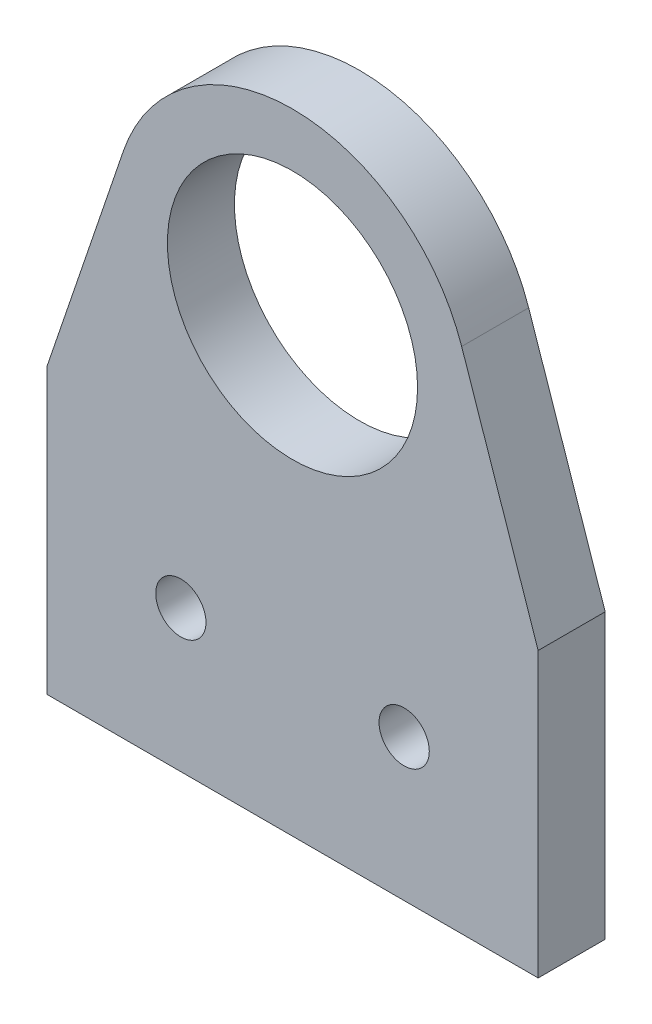
ISO-10303-21;
HEADER;
FILE_DESCRIPTION(('STEP AP214'),'2;1');
FILE_NAME('part.step','',(''),(''),'','','');
FILE_SCHEMA(('AUTOMOTIVE_DESIGN { 1 0 10303 214 1 1 1 1 }'));
ENDSEC;
DATA;
#1=APPLICATION_CONTEXT('core data for automotive mechanical design processes');
#2=APPLICATION_PROTOCOL_DEFINITION('international standard','automotive_design',2000,#1);
#3=PRODUCT_CONTEXT('',#1,'mechanical');
#4=PRODUCT('Part','Part','',(#3));
#5=PRODUCT_RELATED_PRODUCT_CATEGORY('part','',(#4));
#6=PRODUCT_DEFINITION_FORMATION('','',#4);
#7=PRODUCT_DEFINITION_CONTEXT('part definition',#1,'design');
#8=PRODUCT_DEFINITION('design','',#6,#7);
#9=PRODUCT_DEFINITION_SHAPE('','',#8);
#10=(LENGTH_UNIT() NAMED_UNIT(*) SI_UNIT(.MILLI.,.METRE.));
#11=(NAMED_UNIT(*) PLANE_ANGLE_UNIT() SI_UNIT($,.RADIAN.));
#12=(NAMED_UNIT(*) SI_UNIT($,.STERADIAN.) SOLID_ANGLE_UNIT());
#13=UNCERTAINTY_MEASURE_WITH_UNIT(LENGTH_MEASURE(1.E-05),#10,'distance_accuracy_value','');
#14=(GEOMETRIC_REPRESENTATION_CONTEXT(3) GLOBAL_UNCERTAINTY_ASSIGNED_CONTEXT((#13)) GLOBAL_UNIT_ASSIGNED_CONTEXT((#10,
#11,#12)) REPRESENTATION_CONTEXT('',''));
#15=CARTESIAN_POINT('',(0.,0.,0.));
#16=DIRECTION('',(0.,0.,1.));
#17=DIRECTION('',(1.,0.,0.));
#18=AXIS2_PLACEMENT_3D('',#15,#16,#17);
#19=CARTESIAN_POINT('',(0.,0.,6.));
#20=DIRECTION('',(0.,0.,-1.));
#21=DIRECTION('',(-1.,0.,0.));
#22=AXIS2_PLACEMENT_3D('',#19,#20,#21);
#23=CYLINDRICAL_SURFACE('',#22,16.);
#24=CARTESIAN_POINT('',(0.,0.,0.));
#25=DIRECTION('',(0.,0.,1.));
#26=DIRECTION('',(1.,0.,0.));
#27=AXIS2_PLACEMENT_3D('',#24,#25,#26);
#28=CIRCLE('',#27,16.);
#29=CARTESIAN_POINT('',(-15.1482527459947,5.1507706941256,0.));
#30=VERTEX_POINT('',#29);
#31=CARTESIAN_POINT('',(15.1482527459947,5.1507706941256,0.));
#32=VERTEX_POINT('',#31);
#33=EDGE_CURVE('E121',#30,#32,#28,.F.);
#34=ORIENTED_EDGE('',*,*,#33,.F.);
#35=DIRECTION('',(0.,0.,-1.));
#36=VECTOR('',#35,1.);
#37=CARTESIAN_POINT('',(-15.1482527459947,5.1507706941256,6.));
#38=LINE('',#37,#36);
#39=CARTESIAN_POINT('',(-15.1482527459947,5.1507706941256,6.));
#40=VERTEX_POINT('',#39);
#41=EDGE_CURVE('E11',#40,#30,#38,.T.);
#42=ORIENTED_EDGE('',*,*,#41,.F.);
#43=CARTESIAN_POINT('',(0.,0.,6.));
#44=DIRECTION('',(0.,0.,1.));
#45=DIRECTION('',(1.,0.,0.));
#46=AXIS2_PLACEMENT_3D('',#43,#44,#45);
#47=CIRCLE('',#46,16.);
#48=CARTESIAN_POINT('',(15.1482527459947,5.1507706941256,6.));
#49=VERTEX_POINT('',#48);
#50=EDGE_CURVE('E139',#40,#49,#47,.F.);
#51=ORIENTED_EDGE('',*,*,#50,.T.);
#52=DIRECTION('',(0.,0.,-1.));
#53=VECTOR('',#52,1.);
#54=CARTESIAN_POINT('',(15.1482527459947,5.1507706941256,6.));
#55=LINE('',#54,#53);
#56=EDGE_CURVE('E52',#49,#32,#55,.T.);
#57=ORIENTED_EDGE('',*,*,#56,.T.);
#58=EDGE_LOOP('',(#34,#42,#51,#57));
#59=FACE_BOUND('',#58,.T.);
#60=ADVANCED_FACE('F36',(#59),#23,.T.);
#61=CARTESIAN_POINT('',(-15.1482527459947,5.15077069412561,6.));
#62=DIRECTION('',(-0.94676579662467,0.321923168382851,0.));
#63=DIRECTION('',(-0.321923168382851,-0.94676579662467,0.));
#64=AXIS2_PLACEMENT_3D('',#61,#62,#63);
#65=PLANE('',#64);
#66=DIRECTION('',(0.321923168382851,0.946765796624671,0.));
#67=VECTOR('',#66,1.);
#68=CARTESIAN_POINT('',(-15.1482527459947,5.15077069412561,0.));
#69=LINE('',#68,#67);
#70=CARTESIAN_POINT('',(-22.,-15.,0.));
#71=VERTEX_POINT('',#70);
#72=EDGE_CURVE('E123',#71,#30,#69,.T.);
#73=ORIENTED_EDGE('',*,*,#72,.F.);
#74=DIRECTION('',(0.,0.,-1.));
#75=VECTOR('',#74,1.);
#76=CARTESIAN_POINT('',(-22.,-15.,6.));
#77=LINE('',#76,#75);
#78=CARTESIAN_POINT('',(-22.,-15.,6.));
#79=VERTEX_POINT('',#78);
#80=EDGE_CURVE('E44',#79,#71,#77,.T.);
#81=ORIENTED_EDGE('',*,*,#80,.F.);
#82=DIRECTION('',(0.321923168382851,0.946765796624671,0.));
#83=VECTOR('',#82,1.);
#84=CARTESIAN_POINT('',(-15.1482527459947,5.15077069412561,6.));
#85=LINE('',#84,#83);
#86=EDGE_CURVE('E251',#79,#40,#85,.T.);
#87=ORIENTED_EDGE('',*,*,#86,.T.);
#88=ORIENTED_EDGE('',*,*,#41,.T.);
#89=EDGE_LOOP('',(#73,#81,#87,#88));
#90=FACE_BOUND('',#89,.T.);
#91=ADVANCED_FACE('F148',(#90),#65,.T.);
#92=CARTESIAN_POINT('',(-22.,0.,6.));
#93=DIRECTION('',(-1.,0.,0.));
#94=DIRECTION('',(0.,0.,1.));
#95=AXIS2_PLACEMENT_3D('',#92,#93,#94);
#96=PLANE('',#95);
#97=DIRECTION('',(0.,1.,0.));
#98=VECTOR('',#97,1.);
#99=CARTESIAN_POINT('',(-22.,0.,0.));
#100=LINE('',#99,#98);
#101=CARTESIAN_POINT('',(-22.,-40.4,0.));
#102=VERTEX_POINT('',#101);
#103=EDGE_CURVE('E127',#102,#71,#100,.T.);
#104=ORIENTED_EDGE('',*,*,#103,.F.);
#105=DIRECTION('',(0.,0.,-1.));
#106=VECTOR('',#105,1.);
#107=CARTESIAN_POINT('',(-22.,-40.4,6.));
#108=LINE('',#107,#106);
#109=CARTESIAN_POINT('',(-22.,-40.4,6.));
#110=VERTEX_POINT('',#109);
#111=EDGE_CURVE('E110',#110,#102,#108,.T.);
#112=ORIENTED_EDGE('',*,*,#111,.F.);
#113=DIRECTION('',(0.,1.,0.));
#114=VECTOR('',#113,1.);
#115=CARTESIAN_POINT('',(-22.,0.,6.));
#116=LINE('',#115,#114);
#117=EDGE_CURVE('E100',#110,#79,#116,.T.);
#118=ORIENTED_EDGE('',*,*,#117,.T.);
#119=ORIENTED_EDGE('',*,*,#80,.T.);
#120=EDGE_LOOP('',(#104,#112,#118,#119));
#121=FACE_BOUND('',#120,.T.);
#122=ADVANCED_FACE('F145',(#121),#96,.T.);
#123=CARTESIAN_POINT('',(0.,-40.4,6.));
#124=DIRECTION('',(0.,1.,0.));
#125=DIRECTION('',(0.,0.,1.));
#126=AXIS2_PLACEMENT_3D('',#123,#124,#125);
#127=PLANE('',#126);
#128=DIRECTION('',(1.,0.,0.));
#129=VECTOR('',#128,1.);
#130=CARTESIAN_POINT('',(0.,-40.4,0.));
#131=LINE('',#130,#129);
#132=CARTESIAN_POINT('',(22.,-40.4,0.));
#133=VERTEX_POINT('',#132);
#134=EDGE_CURVE('E107',#102,#133,#131,.T.);
#135=ORIENTED_EDGE('',*,*,#134,.T.);
#136=DIRECTION('',(0.,0.,-1.));
#137=VECTOR('',#136,1.);
#138=CARTESIAN_POINT('',(22.,-40.4,6.));
#139=LINE('',#138,#137);
#140=CARTESIAN_POINT('',(22.,-40.4,6.));
#141=VERTEX_POINT('',#140);
#142=EDGE_CURVE('E104',#141,#133,#139,.T.);
#143=ORIENTED_EDGE('',*,*,#142,.F.);
#144=DIRECTION('',(1.,0.,0.));
#145=VECTOR('',#144,1.);
#146=CARTESIAN_POINT('',(0.,-40.4,6.));
#147=LINE('',#146,#145);
#148=EDGE_CURVE('E91',#110,#141,#147,.T.);
#149=ORIENTED_EDGE('',*,*,#148,.F.);
#150=ORIENTED_EDGE('',*,*,#111,.T.);
#151=EDGE_LOOP('',(#135,#143,#149,#150));
#152=FACE_BOUND('',#151,.T.);
#153=ADVANCED_FACE('F105',(#152),#127,.F.);
#154=CARTESIAN_POINT('',(22.,0.,6.));
#155=DIRECTION('',(-1.,0.,0.));
#156=DIRECTION('',(0.,0.,1.));
#157=AXIS2_PLACEMENT_3D('',#154,#155,#156);
#158=PLANE('',#157);
#159=DIRECTION('',(0.,1.,0.));
#160=VECTOR('',#159,1.);
#161=CARTESIAN_POINT('',(22.,0.,0.));
#162=LINE('',#161,#160);
#163=CARTESIAN_POINT('',(22.,-15.,0.));
#164=VERTEX_POINT('',#163);
#165=EDGE_CURVE('E131',#133,#164,#162,.T.);
#166=ORIENTED_EDGE('',*,*,#165,.T.);
#167=DIRECTION('',(0.,0.,-1.));
#168=VECTOR('',#167,1.);
#169=CARTESIAN_POINT('',(22.,-15.,6.));
#170=LINE('',#169,#168);
#171=CARTESIAN_POINT('',(22.,-15.,6.));
#172=VERTEX_POINT('',#171);
#173=EDGE_CURVE('E72',#172,#164,#170,.T.);
#174=ORIENTED_EDGE('',*,*,#173,.F.);
#175=DIRECTION('',(0.,1.,0.));
#176=VECTOR('',#175,1.);
#177=CARTESIAN_POINT('',(22.,0.,6.));
#178=LINE('',#177,#176);
#179=EDGE_CURVE('E97',#141,#172,#178,.T.);
#180=ORIENTED_EDGE('',*,*,#179,.F.);
#181=ORIENTED_EDGE('',*,*,#142,.T.);
#182=EDGE_LOOP('',(#166,#174,#180,#181));
#183=FACE_BOUND('',#182,.T.);
#184=ADVANCED_FACE('F112',(#183),#158,.F.);
#185=CARTESIAN_POINT('',(15.1482527459947,5.1507706941256,6.));
#186=DIRECTION('',(0.94676579662467,0.32192316838285,0.));
#187=DIRECTION('',(-0.32192316838285,0.946765796624671,0.));
#188=AXIS2_PLACEMENT_3D('',#185,#186,#187);
#189=PLANE('',#188);
#190=DIRECTION('',(0.32192316838285,-0.946765796624671,0.));
#191=VECTOR('',#190,1.);
#192=CARTESIAN_POINT('',(15.1482527459947,5.1507706941256,0.));
#193=LINE('',#192,#191);
#194=EDGE_CURVE('E133',#32,#164,#193,.T.);
#195=ORIENTED_EDGE('',*,*,#194,.F.);
#196=ORIENTED_EDGE('',*,*,#56,.F.);
#197=DIRECTION('',(0.32192316838285,-0.946765796624671,0.));
#198=VECTOR('',#197,1.);
#199=CARTESIAN_POINT('',(15.1482527459947,5.1507706941256,6.));
#200=LINE('',#199,#198);
#201=EDGE_CURVE('E113',#49,#172,#200,.T.);
#202=ORIENTED_EDGE('',*,*,#201,.T.);
#203=ORIENTED_EDGE('',*,*,#173,.T.);
#204=EDGE_LOOP('',(#195,#196,#202,#203));
#205=FACE_BOUND('',#204,.T.);
#206=ADVANCED_FACE('F152',(#205),#189,.T.);
#207=CARTESIAN_POINT('',(0.,0.,6.));
#208=DIRECTION('',(0.,0.,-1.));
#209=DIRECTION('',(-1.,0.,0.));
#210=AXIS2_PLACEMENT_3D('',#207,#208,#209);
#211=CYLINDRICAL_SURFACE('',#210,11.2);
#212=CARTESIAN_POINT('',(0.,0.,6.));
#213=DIRECTION('',(0.,0.,1.));
#214=DIRECTION('',(1.,0.,0.));
#215=AXIS2_PLACEMENT_3D('',#212,#213,#214);
#216=CIRCLE('',#215,11.2);
#217=CARTESIAN_POINT('',(11.2,0.,6.));
#218=VERTEX_POINT('',#217);
#219=EDGE_CURVE('E115',#218,#218,#216,.T.);
#220=ORIENTED_EDGE('',*,*,#219,.T.);
#221=EDGE_LOOP('',(#220));
#222=FACE_BOUND('',#221,.T.);
#223=CARTESIAN_POINT('',(0.,0.,0.));
#224=DIRECTION('',(0.,0.,1.));
#225=DIRECTION('',(1.,0.,0.));
#226=AXIS2_PLACEMENT_3D('',#223,#224,#225);
#227=CIRCLE('',#226,11.2);
#228=CARTESIAN_POINT('',(11.2,0.,0.));
#229=VERTEX_POINT('',#228);
#230=EDGE_CURVE('E136',#229,#229,#227,.T.);
#231=ORIENTED_EDGE('',*,*,#230,.F.);
#232=EDGE_LOOP('',(#231));
#233=FACE_BOUND('',#232,.T.);
#234=ADVANCED_FACE('F154',(#222,#233),#211,.F.);
#235=CARTESIAN_POINT('',(0.,0.,6.));
#236=DIRECTION('',(0.,0.,1.));
#237=DIRECTION('',(1.,0.,0.));
#238=AXIS2_PLACEMENT_3D('',#235,#236,#237);
#239=PLANE('',#238);
#240=CARTESIAN_POINT('',(-10.,-27.7,6.));
#241=DIRECTION('',(0.,0.,1.));
#242=DIRECTION('',(1.,0.,0.));
#243=AXIS2_PLACEMENT_3D('',#240,#241,#242);
#244=CIRCLE('',#243,2.24999999999999);
#245=CARTESIAN_POINT('',(-7.75000000000001,-27.7,6.));
#246=VERTEX_POINT('',#245);
#247=EDGE_CURVE('E241',#246,#246,#244,.T.);
#248=ORIENTED_EDGE('',*,*,#247,.F.);
#249=EDGE_LOOP('',(#248));
#250=FACE_BOUND('',#249,.T.);
#251=CARTESIAN_POINT('',(10.,-27.7,6.));
#252=DIRECTION('',(0.,0.,1.));
#253=DIRECTION('',(1.,0.,0.));
#254=AXIS2_PLACEMENT_3D('',#251,#252,#253);
#255=CIRCLE('',#254,2.24999999999999);
#256=CARTESIAN_POINT('',(12.25,-27.7,6.));
#257=VERTEX_POINT('',#256);
#258=EDGE_CURVE('E243',#257,#257,#255,.T.);
#259=ORIENTED_EDGE('',*,*,#258,.F.);
#260=EDGE_LOOP('',(#259));
#261=FACE_BOUND('',#260,.T.);
#262=ORIENTED_EDGE('',*,*,#50,.F.);
#263=ORIENTED_EDGE('',*,*,#86,.F.);
#264=ORIENTED_EDGE('',*,*,#117,.F.);
#265=ORIENTED_EDGE('',*,*,#148,.T.);
#266=ORIENTED_EDGE('',*,*,#179,.T.);
#267=ORIENTED_EDGE('',*,*,#201,.F.);
#268=EDGE_LOOP('',(#262,#263,#264,#265,#266,#267));
#269=FACE_BOUND('',#268,.T.);
#270=ORIENTED_EDGE('',*,*,#219,.F.);
#271=EDGE_LOOP('',(#270));
#272=FACE_BOUND('',#271,.T.);
#273=ADVANCED_FACE('F93',(#250,#261,#269,#272),#239,.T.);
#274=CARTESIAN_POINT('',(0.,0.,0.));
#275=DIRECTION('',(0.,0.,1.));
#276=DIRECTION('',(1.,0.,0.));
#277=AXIS2_PLACEMENT_3D('',#274,#275,#276);
#278=PLANE('',#277);
#279=CARTESIAN_POINT('',(-10.,-27.7,0.));
#280=DIRECTION('',(0.,0.,1.));
#281=DIRECTION('',(1.,0.,0.));
#282=AXIS2_PLACEMENT_3D('',#279,#280,#281);
#283=CIRCLE('',#282,2.25);
#284=CARTESIAN_POINT('',(-7.75,-27.7,0.));
#285=VERTEX_POINT('',#284);
#286=EDGE_CURVE('E238',#285,#285,#283,.T.);
#287=ORIENTED_EDGE('',*,*,#286,.T.);
#288=EDGE_LOOP('',(#287));
#289=FACE_BOUND('',#288,.T.);
#290=CARTESIAN_POINT('',(10.,-27.7,0.));
#291=DIRECTION('',(0.,0.,1.));
#292=DIRECTION('',(1.,0.,0.));
#293=AXIS2_PLACEMENT_3D('',#290,#291,#292);
#294=CIRCLE('',#293,2.25);
#295=CARTESIAN_POINT('',(12.25,-27.7,0.));
#296=VERTEX_POINT('',#295);
#297=EDGE_CURVE('E124',#296,#296,#294,.T.);
#298=ORIENTED_EDGE('',*,*,#297,.T.);
#299=EDGE_LOOP('',(#298));
#300=FACE_BOUND('',#299,.T.);
#301=ORIENTED_EDGE('',*,*,#33,.T.);
#302=ORIENTED_EDGE('',*,*,#194,.T.);
#303=ORIENTED_EDGE('',*,*,#165,.F.);
#304=ORIENTED_EDGE('',*,*,#134,.F.);
#305=ORIENTED_EDGE('',*,*,#103,.T.);
#306=ORIENTED_EDGE('',*,*,#72,.T.);
#307=EDGE_LOOP('',(#301,#302,#303,#304,#305,#306));
#308=FACE_BOUND('',#307,.T.);
#309=ORIENTED_EDGE('',*,*,#230,.T.);
#310=EDGE_LOOP('',(#309));
#311=FACE_BOUND('',#310,.T.);
#312=ADVANCED_FACE('F150',(#289,#300,#308,#311),#278,.F.);
#313=CARTESIAN_POINT('',(10.,-27.7,6.));
#314=DIRECTION('',(0.,0.,1.));
#315=DIRECTION('',(1.,0.,0.));
#316=AXIS2_PLACEMENT_3D('',#313,#314,#315);
#317=CYLINDRICAL_SURFACE('',#316,2.24999999999999);
#318=ORIENTED_EDGE('',*,*,#297,.F.);
#319=EDGE_LOOP('',(#318));
#320=FACE_BOUND('',#319,.T.);
#321=ORIENTED_EDGE('',*,*,#258,.T.);
#322=EDGE_LOOP('',(#321));
#323=FACE_BOUND('',#322,.T.);
#324=ADVANCED_FACE('F211',(#320,#323),#317,.F.);
#325=CARTESIAN_POINT('',(-10.,-27.7,6.));
#326=DIRECTION('',(0.,0.,1.));
#327=DIRECTION('',(1.,0.,0.));
#328=AXIS2_PLACEMENT_3D('',#325,#326,#327);
#329=CYLINDRICAL_SURFACE('',#328,2.24999999999999);
#330=ORIENTED_EDGE('',*,*,#286,.F.);
#331=EDGE_LOOP('',(#330));
#332=FACE_BOUND('',#331,.T.);
#333=ORIENTED_EDGE('',*,*,#247,.T.);
#334=EDGE_LOOP('',(#333));
#335=FACE_BOUND('',#334,.T.);
#336=ADVANCED_FACE('F221',(#332,#335),#329,.F.);
#337=CLOSED_SHELL('',(#60,#91,#122,#153,#184,#206,#234,#273,#312,#324,#336));
#338=MANIFOLD_SOLID_BREP('B2',#337);
#339=ADVANCED_BREP_SHAPE_REPRESENTATION('',(#18,#338),#14);
#340=SHAPE_DEFINITION_REPRESENTATION(#9,#339);
ENDSEC;
END-ISO-10303-21;
